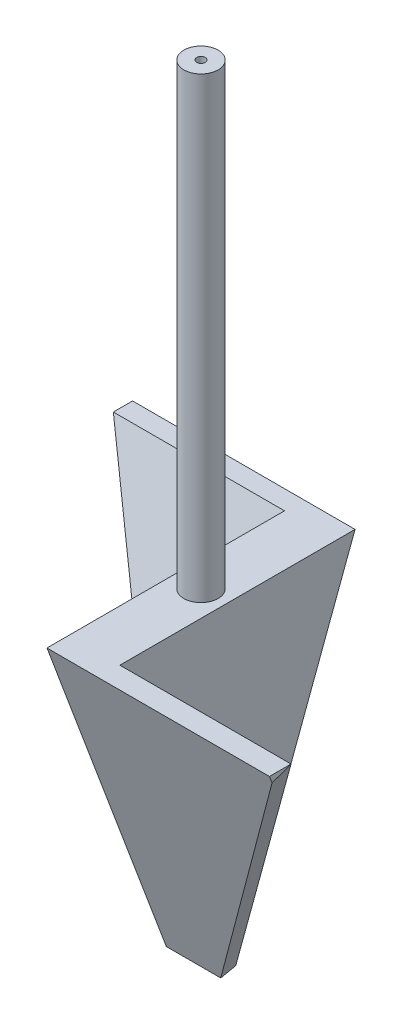
ISO-10303-21;
HEADER;
FILE_DESCRIPTION(('STEP AP214'),'2;1');
FILE_NAME('part.step','',(''),(''),'','','');
FILE_SCHEMA(('AUTOMOTIVE_DESIGN { 1 0 10303 214 1 1 1 1 }'));
ENDSEC;
DATA;
#1=APPLICATION_CONTEXT('core data for automotive mechanical design processes');
#2=APPLICATION_PROTOCOL_DEFINITION('international standard','automotive_design',2000,#1);
#3=PRODUCT_CONTEXT('',#1,'mechanical');
#4=PRODUCT('Part','Part','',(#3));
#5=PRODUCT_RELATED_PRODUCT_CATEGORY('part','',(#4));
#6=PRODUCT_DEFINITION_FORMATION('','',#4);
#7=PRODUCT_DEFINITION_CONTEXT('part definition',#1,'design');
#8=PRODUCT_DEFINITION('design','',#6,#7);
#9=PRODUCT_DEFINITION_SHAPE('','',#8);
#10=(LENGTH_UNIT() NAMED_UNIT(*) SI_UNIT(.MILLI.,.METRE.));
#11=(NAMED_UNIT(*) PLANE_ANGLE_UNIT() SI_UNIT($,.RADIAN.));
#12=(NAMED_UNIT(*) SI_UNIT($,.STERADIAN.) SOLID_ANGLE_UNIT());
#13=UNCERTAINTY_MEASURE_WITH_UNIT(LENGTH_MEASURE(1.E-05),#10,'distance_accuracy_value','');
#14=(GEOMETRIC_REPRESENTATION_CONTEXT(3) GLOBAL_UNCERTAINTY_ASSIGNED_CONTEXT((#13)) GLOBAL_UNIT_ASSIGNED_CONTEXT((#10,
#11,#12)) REPRESENTATION_CONTEXT('',''));
#15=CARTESIAN_POINT('',(0.,0.,0.));
#16=DIRECTION('',(0.,0.,1.));
#17=DIRECTION('',(1.,0.,0.));
#18=AXIS2_PLACEMENT_3D('',#15,#16,#17);
#19=CARTESIAN_POINT('',(3.,0.,0.));
#20=DIRECTION('',(-1.,0.,0.));
#21=DIRECTION('',(0.,0.,1.));
#22=AXIS2_PLACEMENT_3D('',#19,#20,#21);
#23=PLANE('',#22);
#24=DIRECTION('',(0.,0.939681117741111,0.342051746028019));
#25=VECTOR('',#24,1.);
#26=CARTESIAN_POINT('',(3.,1.31529601220461,-1.05573600457673));
#27=LINE('',#26,#25);
#28=CARTESIAN_POINT('',(3.,1.31529601220461,-1.05573600457673));
#29=VERTEX_POINT('',#28);
#30=CARTESIAN_POINT('',(3.,38.5,12.4798056642138));
#31=VERTEX_POINT('',#30);
#32=EDGE_CURVE('E202',#29,#31,#27,.T.);
#33=ORIENTED_EDGE('',*,*,#32,.F.);
#34=DIRECTION('',(0.,0.936329177569045,-0.351123441588392));
#35=VECTOR('',#34,1.);
#36=CARTESIAN_POINT('',(3.,38.5,-15.));
#37=LINE('',#36,#35);
#38=CARTESIAN_POINT('',(3.,38.5,-15.));
#39=VERTEX_POINT('',#38);
#40=EDGE_CURVE('E96',#29,#39,#37,.T.);
#41=ORIENTED_EDGE('',*,*,#40,.T.);
#42=DIRECTION('',(0.,0.,1.));
#43=VECTOR('',#42,1.);
#44=CARTESIAN_POINT('',(3.,38.5,0.));
#45=LINE('',#44,#43);
#46=EDGE_CURVE('E175',#39,#31,#45,.T.);
#47=ORIENTED_EDGE('',*,*,#46,.T.);
#48=EDGE_LOOP('',(#33,#41,#47));
#49=FACE_BOUND('',#48,.T.);
#50=ADVANCED_FACE('F73',(#49),#23,.F.);
#51=CARTESIAN_POINT('',(-3.,38.5,-15.));
#52=DIRECTION('',(0.,-0.351123441588392,-0.936329177569044));
#53=DIRECTION('',(0.,0.936329177569045,-0.351123441588392));
#54=AXIS2_PLACEMENT_3D('',#51,#52,#53);
#55=PLANE('',#54);
#56=DIRECTION('',(0.450206725787742,-0.836071127107549,0.313526672665331));
#57=VECTOR('',#56,1.);
#58=CARTESIAN_POINT('',(-19.2603219112402,30.823645791196,-12.1213671716985));
#59=LINE('',#58,#57);
#60=CARTESIAN_POINT('',(-23.,37.7685373167903,-14.7257014937964));
#61=VERTEX_POINT('',#60);
#62=CARTESIAN_POINT('',(-3.37069588939786,1.31529601220461,-1.05573600457673));
#63=VERTEX_POINT('',#62);
#64=EDGE_CURVE('E137',#61,#63,#59,.T.);
#65=ORIENTED_EDGE('',*,*,#64,.F.);
#66=DIRECTION('',(0.,-0.936329177569045,0.351123441588392));
#67=VECTOR('',#66,1.);
#68=CARTESIAN_POINT('',(-23.,38.5,-15.));
#69=LINE('',#68,#67);
#70=CARTESIAN_POINT('',(-23.,38.5,-15.));
#71=VERTEX_POINT('',#70);
#72=EDGE_CURVE('E408',#71,#61,#69,.T.);
#73=ORIENTED_EDGE('',*,*,#72,.F.);
#74=DIRECTION('',(1.,0.,0.));
#75=VECTOR('',#74,1.);
#76=CARTESIAN_POINT('',(-3.,38.5,-15.));
#77=LINE('',#76,#75);
#78=EDGE_CURVE('E172',#71,#39,#77,.T.);
#79=ORIENTED_EDGE('',*,*,#78,.T.);
#80=ORIENTED_EDGE('',*,*,#40,.F.);
#81=DIRECTION('',(-1.,0.,0.));
#82=VECTOR('',#81,1.);
#83=CARTESIAN_POINT('',(10.,1.31529601220461,-1.05573600457673));
#84=LINE('',#83,#82);
#85=EDGE_CURVE('E166',#29,#63,#84,.T.);
#86=ORIENTED_EDGE('',*,*,#85,.T.);
#87=EDGE_LOOP('',(#65,#73,#79,#80,#86));
#88=FACE_BOUND('',#87,.T.);
#89=ADVANCED_FACE('F235',(#88),#55,.T.);
#90=CARTESIAN_POINT('',(-3.,38.5,15.));
#91=DIRECTION('',(0.,-0.351123441588392,0.936329177569044));
#92=DIRECTION('',(0.,-0.936329177569045,-0.351123441588392));
#93=AXIS2_PLACEMENT_3D('',#90,#91,#92);
#94=PLANE('',#93);
#95=DIRECTION('',(-0.451057241230981,-0.835669130373471,-0.313375923890051));
#96=VECTOR('',#95,1.);
#97=CARTESIAN_POINT('',(18.0572747542853,28.5354755437812,11.263303328918));
#98=LINE('',#97,#96);
#99=CARTESIAN_POINT('',(23.,37.6928119751594,14.6973044906848));
#100=VERTEX_POINT('',#99);
#101=CARTESIAN_POINT('',(3.36502558643842,1.31529601220461,1.05573600457673));
#102=VERTEX_POINT('',#101);
#103=EDGE_CURVE('E194',#100,#102,#98,.T.);
#104=ORIENTED_EDGE('',*,*,#103,.F.);
#105=DIRECTION('',(0.,-0.936329177569045,-0.351123441588392));
#106=VECTOR('',#105,1.);
#107=CARTESIAN_POINT('',(23.,38.5,15.));
#108=LINE('',#107,#106);
#109=CARTESIAN_POINT('',(23.,38.5,15.));
#110=VERTEX_POINT('',#109);
#111=EDGE_CURVE('E201',#110,#100,#108,.T.);
#112=ORIENTED_EDGE('',*,*,#111,.F.);
#113=DIRECTION('',(1.,0.,0.));
#114=VECTOR('',#113,1.);
#115=CARTESIAN_POINT('',(-3.,38.5,15.));
#116=LINE('',#115,#114);
#117=CARTESIAN_POINT('',(-3.,38.5,15.));
#118=VERTEX_POINT('',#117);
#119=EDGE_CURVE('E171',#118,#110,#116,.T.);
#120=ORIENTED_EDGE('',*,*,#119,.F.);
#121=DIRECTION('',(0.,-0.936329177569045,-0.351123441588392));
#122=VECTOR('',#121,1.);
#123=CARTESIAN_POINT('',(-3.,38.5,15.));
#124=LINE('',#123,#122);
#125=CARTESIAN_POINT('',(-3.,1.31529601220461,1.05573600457673));
#126=VERTEX_POINT('',#125);
#127=EDGE_CURVE('E156',#118,#126,#124,.T.);
#128=ORIENTED_EDGE('',*,*,#127,.T.);
#129=DIRECTION('',(-1.,0.,0.));
#130=VECTOR('',#129,1.);
#131=CARTESIAN_POINT('',(10.,1.31529601220461,1.05573600457673));
#132=LINE('',#131,#130);
#133=EDGE_CURVE('E161',#102,#126,#132,.T.);
#134=ORIENTED_EDGE('',*,*,#133,.F.);
#135=EDGE_LOOP('',(#104,#112,#120,#128,#134));
#136=FACE_BOUND('',#135,.T.);
#137=ADVANCED_FACE('F169',(#136),#94,.T.);
#138=CARTESIAN_POINT('',(-3.,0.,0.));
#139=DIRECTION('',(-1.,0.,0.));
#140=DIRECTION('',(0.,0.,1.));
#141=AXIS2_PLACEMENT_3D('',#138,#139,#140);
#142=PLANE('',#141);
#143=DIRECTION('',(0.,0.937419001268375,-0.348203411903162));
#144=VECTOR('',#143,1.);
#145=CARTESIAN_POINT('',(-3.,1.31529601220461,1.05573600457673));
#146=LINE('',#145,#144);
#147=CARTESIAN_POINT('',(-3.,38.5,-12.7564875386205));
#148=VERTEX_POINT('',#147);
#149=EDGE_CURVE('E148',#126,#148,#146,.T.);
#150=ORIENTED_EDGE('',*,*,#149,.F.);
#151=ORIENTED_EDGE('',*,*,#127,.F.);
#152=DIRECTION('',(0.,0.,1.));
#153=VECTOR('',#152,1.);
#154=CARTESIAN_POINT('',(-3.,38.5,0.));
#155=LINE('',#154,#153);
#156=EDGE_CURVE('E88',#148,#118,#155,.T.);
#157=ORIENTED_EDGE('',*,*,#156,.F.);
#158=EDGE_LOOP('',(#150,#151,#157));
#159=FACE_BOUND('',#158,.T.);
#160=ADVANCED_FACE('F154',(#159),#142,.T.);
#161=CARTESIAN_POINT('',(0.,92.,0.));
#162=DIRECTION('',(0.,-1.,0.));
#163=DIRECTION('',(0.,0.,-1.));
#164=AXIS2_PLACEMENT_3D('',#161,#162,#163);
#165=CYLINDRICAL_SURFACE('',#164,2.);
#166=CARTESIAN_POINT('',(0.,38.5,0.));
#167=DIRECTION('',(0.,1.,0.));
#168=DIRECTION('',(0.,0.,1.));
#169=AXIS2_PLACEMENT_3D('',#166,#167,#168);
#170=CIRCLE('',#169,2.);
#171=CARTESIAN_POINT('',(0.,38.5,2.));
#172=VERTEX_POINT('',#171);
#173=EDGE_CURVE('E179',#172,#172,#170,.T.);
#174=ORIENTED_EDGE('',*,*,#173,.T.);
#175=EDGE_LOOP('',(#174));
#176=FACE_BOUND('',#175,.T.);
#177=CARTESIAN_POINT('',(0.,92.,0.));
#178=DIRECTION('',(0.,1.,0.));
#179=DIRECTION('',(0.,0.,1.));
#180=AXIS2_PLACEMENT_3D('',#177,#178,#179);
#181=CIRCLE('',#180,2.);
#182=CARTESIAN_POINT('',(0.,92.,2.));
#183=VERTEX_POINT('',#182);
#184=EDGE_CURVE('E184',#183,#183,#181,.T.);
#185=ORIENTED_EDGE('',*,*,#184,.F.);
#186=EDGE_LOOP('',(#185));
#187=FACE_BOUND('',#186,.T.);
#188=ADVANCED_FACE('F75',(#176,#187),#165,.T.);
#189=CARTESIAN_POINT('',(0.,92.,0.));
#190=DIRECTION('',(0.,1.,0.));
#191=DIRECTION('',(0.,0.,1.));
#192=AXIS2_PLACEMENT_3D('',#189,#190,#191);
#193=PLANE('',#192);
#194=CARTESIAN_POINT('',(0.,92.,0.));
#195=DIRECTION('',(0.,1.,0.));
#196=DIRECTION('',(0.,0.,1.));
#197=AXIS2_PLACEMENT_3D('',#194,#195,#196);
#198=CIRCLE('',#197,0.5);
#199=CARTESIAN_POINT('',(0.,92.,0.5));
#200=VERTEX_POINT('',#199);
#201=EDGE_CURVE('E181',#200,#200,#198,.T.);
#202=ORIENTED_EDGE('',*,*,#201,.F.);
#203=EDGE_LOOP('',(#202));
#204=FACE_BOUND('',#203,.T.);
#205=ORIENTED_EDGE('',*,*,#184,.T.);
#206=EDGE_LOOP('',(#205));
#207=FACE_BOUND('',#206,.T.);
#208=ADVANCED_FACE('F259',(#204,#207),#193,.T.);
#209=CARTESIAN_POINT('',(0.,92.,0.));
#210=DIRECTION('',(0.,-1.,0.));
#211=DIRECTION('',(0.,0.,-1.));
#212=AXIS2_PLACEMENT_3D('',#209,#210,#211);
#213=CYLINDRICAL_SURFACE('',#212,0.5);
#214=CARTESIAN_POINT('',(0.,86.,0.));
#215=DIRECTION('',(0.,1.,0.));
#216=DIRECTION('',(0.,0.,1.));
#217=AXIS2_PLACEMENT_3D('',#214,#215,#216);
#218=CIRCLE('',#217,0.5);
#219=CARTESIAN_POINT('',(0.,86.,0.5));
#220=VERTEX_POINT('',#219);
#221=EDGE_CURVE('E187',#220,#220,#218,.T.);
#222=ORIENTED_EDGE('',*,*,#221,.F.);
#223=EDGE_LOOP('',(#222));
#224=FACE_BOUND('',#223,.T.);
#225=ORIENTED_EDGE('',*,*,#201,.T.);
#226=EDGE_LOOP('',(#225));
#227=FACE_BOUND('',#226,.T.);
#228=ADVANCED_FACE('F228',(#224,#227),#213,.F.);
#229=CARTESIAN_POINT('',(0.,86.,0.));
#230=DIRECTION('',(0.,1.,0.));
#231=DIRECTION('',(0.,0.,1.));
#232=AXIS2_PLACEMENT_3D('',#229,#230,#231);
#233=PLANE('',#232);
#234=ORIENTED_EDGE('',*,*,#221,.T.);
#235=EDGE_LOOP('',(#234));
#236=FACE_BOUND('',#235,.T.);
#237=ADVANCED_FACE('F220',(#236),#233,.T.);
#238=CARTESIAN_POINT('',(-3.,38.5,0.));
#239=DIRECTION('',(0.,1.,0.));
#240=DIRECTION('',(0.,0.,1.));
#241=AXIS2_PLACEMENT_3D('',#238,#239,#240);
#242=PLANE('',#241);
#243=ORIENTED_EDGE('',*,*,#173,.F.);
#244=EDGE_LOOP('',(#243));
#245=FACE_BOUND('',#244,.T.);
#246=ORIENTED_EDGE('',*,*,#119,.T.);
#247=DIRECTION('',(0.,0.,1.));
#248=VECTOR('',#247,1.);
#249=CARTESIAN_POINT('',(23.,38.5,12.4798056642138));
#250=LINE('',#249,#248);
#251=CARTESIAN_POINT('',(23.,38.5,12.4798056642138));
#252=VERTEX_POINT('',#251);
#253=EDGE_CURVE('E206',#252,#110,#250,.T.);
#254=ORIENTED_EDGE('',*,*,#253,.F.);
#255=DIRECTION('',(-1.,0.,0.));
#256=VECTOR('',#255,1.);
#257=CARTESIAN_POINT('',(23.,38.5,12.4798056642138));
#258=LINE('',#257,#256);
#259=EDGE_CURVE('E167',#252,#31,#258,.T.);
#260=ORIENTED_EDGE('',*,*,#259,.T.);
#261=ORIENTED_EDGE('',*,*,#46,.F.);
#262=ORIENTED_EDGE('',*,*,#78,.F.);
#263=DIRECTION('',(0.,0.,-1.));
#264=VECTOR('',#263,1.);
#265=CARTESIAN_POINT('',(-23.,38.5,-12.7564875386205));
#266=LINE('',#265,#264);
#267=CARTESIAN_POINT('',(-23.,38.5,-12.7564875386205));
#268=VERTEX_POINT('',#267);
#269=EDGE_CURVE('E157',#268,#71,#266,.T.);
#270=ORIENTED_EDGE('',*,*,#269,.F.);
#271=DIRECTION('',(1.,0.,0.));
#272=VECTOR('',#271,1.);
#273=CARTESIAN_POINT('',(-23.,38.5,-12.7564875386205));
#274=LINE('',#273,#272);
#275=EDGE_CURVE('E149',#268,#148,#274,.T.);
#276=ORIENTED_EDGE('',*,*,#275,.T.);
#277=ORIENTED_EDGE('',*,*,#156,.T.);
#278=EDGE_LOOP('',(#246,#254,#260,#261,#262,#270,#276,#277));
#279=FACE_BOUND('',#278,.T.);
#280=ADVANCED_FACE('F218',(#245,#279),#242,.T.);
#281=CARTESIAN_POINT('',(10.,1.31529601220461,1.05573600457673));
#282=DIRECTION('',(0.,-1.,0.));
#283=DIRECTION('',(0.,0.,-1.));
#284=AXIS2_PLACEMENT_3D('',#281,#282,#283);
#285=PLANE('',#284);
#286=DIRECTION('',(0.172918134462014,0.,0.98493620035725));
#287=VECTOR('',#286,1.);
#288=CARTESIAN_POINT('',(-2.6112911440643,1.31529601220461,3.26980929886517));
#289=LINE('',#288,#287);
#290=EDGE_CURVE('E131',#63,#126,#289,.T.);
#291=ORIENTED_EDGE('',*,*,#290,.F.);
#292=ORIENTED_EDGE('',*,*,#85,.F.);
#293=DIRECTION('',(-0.170350449191309,0.,-0.985383541805078));
#294=VECTOR('',#293,1.);
#295=CARTESIAN_POINT('',(3.5575677371443,1.31529601220461,2.16948631935431));
#296=LINE('',#295,#294);
#297=EDGE_CURVE('E163',#102,#29,#296,.T.);
#298=ORIENTED_EDGE('',*,*,#297,.F.);
#299=ORIENTED_EDGE('',*,*,#133,.T.);
#300=EDGE_LOOP('',(#291,#292,#298,#299));
#301=FACE_BOUND('',#300,.T.);
#302=ADVANCED_FACE('F162',(#301),#285,.T.);
#303=CARTESIAN_POINT('',(23.,1.31529601220461,-1.05573600457673));
#304=DIRECTION('',(0.,-0.342051746028019,0.939681117741111));
#305=DIRECTION('',(0.,-0.939681117741111,-0.342051746028019));
#306=AXIS2_PLACEMENT_3D('',#303,#304,#305);
#307=PLANE('',#306);
#308=ORIENTED_EDGE('',*,*,#259,.F.);
#309=DIRECTION('',(0.451074044110631,0.838652740341579,0.305276575988465));
#310=VECTOR('',#309,1.);
#311=CARTESIAN_POINT('',(23.,38.5,12.4798056642138));
#312=LINE('',#311,#310);
#313=EDGE_CURVE('E196',#29,#252,#312,.T.);
#314=ORIENTED_EDGE('',*,*,#313,.F.);
#315=ORIENTED_EDGE('',*,*,#32,.T.);
#316=EDGE_LOOP('',(#308,#314,#315));
#317=FACE_BOUND('',#316,.T.);
#318=ADVANCED_FACE('F217',(#317),#307,.F.);
#319=CARTESIAN_POINT('',(23.,0.,0.));
#320=DIRECTION('',(1.,0.,0.));
#321=DIRECTION('',(0.,0.,-1.));
#322=AXIS2_PLACEMENT_3D('',#319,#320,#321);
#323=PLANE('',#322);
#324=DIRECTION('',(0.,-0.342051746028019,0.939681117741111));
#325=VECTOR('',#324,1.);
#326=CARTESIAN_POINT('',(23.,38.006776950255,13.8347830676681));
#327=LINE('',#326,#325);
#328=EDGE_CURVE('E81',#252,#100,#327,.T.);
#329=ORIENTED_EDGE('',*,*,#328,.F.);
#330=ORIENTED_EDGE('',*,*,#253,.T.);
#331=ORIENTED_EDGE('',*,*,#111,.T.);
#332=EDGE_LOOP('',(#329,#330,#331));
#333=FACE_BOUND('',#332,.T.);
#334=ADVANCED_FACE('F204',(#333),#323,.T.);
#335=CARTESIAN_POINT('',(23.,33.3692238095797,26.5750224303305));
#336=DIRECTION('',(-0.89248653027913,0.423865761953881,0.154290664375961));
#337=DIRECTION('',(-0.429002856169608,-0.903303132618458,0.));
#338=AXIS2_PLACEMENT_3D('',#335,#336,#337);
#339=PLANE('',#338);
#340=ORIENTED_EDGE('',*,*,#103,.T.);
#341=ORIENTED_EDGE('',*,*,#297,.T.);
#342=ORIENTED_EDGE('',*,*,#313,.T.);
#343=ORIENTED_EDGE('',*,*,#328,.T.);
#344=EDGE_LOOP('',(#340,#341,#342,#343));
#345=FACE_BOUND('',#344,.T.);
#346=ADVANCED_FACE('F193',(#345),#339,.F.);
#347=CARTESIAN_POINT('',(-23.,1.31529601220461,1.05573600457673));
#348=DIRECTION('',(0.,-0.348203411903162,-0.937419001268375));
#349=DIRECTION('',(0.,0.937419001268375,-0.348203411903162));
#350=AXIS2_PLACEMENT_3D('',#347,#348,#349);
#351=PLANE('',#350);
#352=ORIENTED_EDGE('',*,*,#275,.F.);
#353=DIRECTION('',(-0.450208469295206,0.837043433177036,-0.310919000947302));
#354=VECTOR('',#353,1.);
#355=CARTESIAN_POINT('',(-3.,1.31529601220461,1.05573600457673));
#356=LINE('',#355,#354);
#357=EDGE_CURVE('E134',#126,#268,#356,.T.);
#358=ORIENTED_EDGE('',*,*,#357,.F.);
#359=ORIENTED_EDGE('',*,*,#149,.T.);
#360=EDGE_LOOP('',(#352,#358,#359));
#361=FACE_BOUND('',#360,.T.);
#362=ADVANCED_FACE('F147',(#361),#351,.F.);
#363=CARTESIAN_POINT('',(-23.,0.,0.));
#364=DIRECTION('',(-1.,0.,0.));
#365=DIRECTION('',(0.,0.,1.));
#366=AXIS2_PLACEMENT_3D('',#363,#364,#365);
#367=PLANE('',#366);
#368=DIRECTION('',(0.,-0.348203411903162,-0.937419001268375));
#369=VECTOR('',#368,1.);
#370=CARTESIAN_POINT('',(-23.,37.9959207017789,-14.1135492334379));
#371=LINE('',#370,#369);
#372=EDGE_CURVE('E12',#268,#61,#371,.T.);
#373=ORIENTED_EDGE('',*,*,#372,.F.);
#374=ORIENTED_EDGE('',*,*,#269,.T.);
#375=ORIENTED_EDGE('',*,*,#72,.T.);
#376=EDGE_LOOP('',(#373,#374,#375));
#377=FACE_BOUND('',#376,.T.);
#378=ADVANCED_FACE('F380',(#377),#367,.T.);
#379=CARTESIAN_POINT('',(-3.,-5.64877222585864,-17.6926440207908));
#380=DIRECTION('',(0.892923476102441,0.422033973649276,-0.156764125076291));
#381=DIRECTION('',(-0.427317294260539,0.904101725485496,0.));
#382=AXIS2_PLACEMENT_3D('',#379,#380,#381);
#383=PLANE('',#382);
#384=ORIENTED_EDGE('',*,*,#64,.T.);
#385=ORIENTED_EDGE('',*,*,#290,.T.);
#386=ORIENTED_EDGE('',*,*,#357,.T.);
#387=ORIENTED_EDGE('',*,*,#372,.T.);
#388=EDGE_LOOP('',(#384,#385,#386,#387));
#389=FACE_BOUND('',#388,.T.);
#390=ADVANCED_FACE('F133',(#389),#383,.F.);
#391=CLOSED_SHELL('',(#50,#89,#137,#160,#188,#208,#228,#237,#280,#302,#318,#334,#346,#362,#378,#390));
#392=MANIFOLD_SOLID_BREP('B2',#391);
#393=ADVANCED_BREP_SHAPE_REPRESENTATION('',(#18,#392),#14);
#394=SHAPE_DEFINITION_REPRESENTATION(#9,#393);
ENDSEC;
END-ISO-10303-21;
